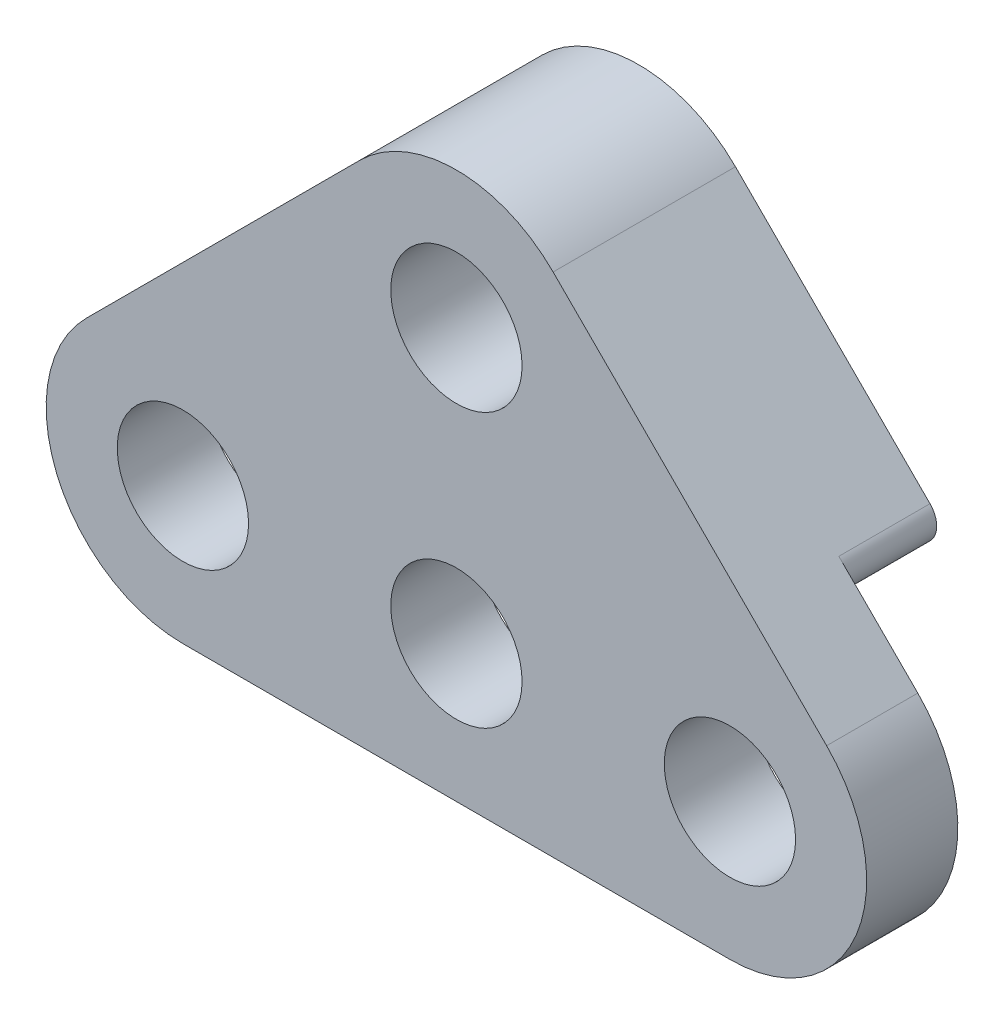
ISO-10303-21;
HEADER;
FILE_DESCRIPTION(('STEP AP214'),'2;1');
FILE_NAME('part.step','',(''),(''),'','','');
FILE_SCHEMA(('AUTOMOTIVE_DESIGN { 1 0 10303 214 1 1 1 1 }'));
ENDSEC;
DATA;
#1=APPLICATION_CONTEXT('core data for automotive mechanical design processes');
#2=APPLICATION_PROTOCOL_DEFINITION('international standard','automotive_design',2000,#1);
#3=PRODUCT_CONTEXT('',#1,'mechanical');
#4=PRODUCT('Part','Part','',(#3));
#5=PRODUCT_RELATED_PRODUCT_CATEGORY('part','',(#4));
#6=PRODUCT_DEFINITION_FORMATION('','',#4);
#7=PRODUCT_DEFINITION_CONTEXT('part definition',#1,'design');
#8=PRODUCT_DEFINITION('design','',#6,#7);
#9=PRODUCT_DEFINITION_SHAPE('','',#8);
#10=(LENGTH_UNIT() NAMED_UNIT(*) SI_UNIT(.MILLI.,.METRE.));
#11=(NAMED_UNIT(*) PLANE_ANGLE_UNIT() SI_UNIT($,.RADIAN.));
#12=(NAMED_UNIT(*) SI_UNIT($,.STERADIAN.) SOLID_ANGLE_UNIT());
#13=UNCERTAINTY_MEASURE_WITH_UNIT(LENGTH_MEASURE(1.E-05),#10,'distance_accuracy_value','');
#14=(GEOMETRIC_REPRESENTATION_CONTEXT(3) GLOBAL_UNCERTAINTY_ASSIGNED_CONTEXT((#13)) GLOBAL_UNIT_ASSIGNED_CONTEXT((#10,
#11,#12)) REPRESENTATION_CONTEXT('',''));
#15=CARTESIAN_POINT('',(0.,0.,0.));
#16=DIRECTION('',(0.,0.,1.));
#17=DIRECTION('',(1.,0.,0.));
#18=AXIS2_PLACEMENT_3D('',#15,#16,#17);
#19=CARTESIAN_POINT('',(0.,-4.7625,3.175));
#20=DIRECTION('',(0.,1.,0.));
#21=DIRECTION('',(-1.,0.,0.));
#22=AXIS2_PLACEMENT_3D('',#19,#20,#21);
#23=PLANE('',#22);
#24=DIRECTION('',(1.,0.,0.));
#25=VECTOR('',#24,1.);
#26=CARTESIAN_POINT('',(0.,-4.7625,0.));
#27=LINE('',#26,#25);
#28=CARTESIAN_POINT('',(-9.525,-4.7625,0.));
#29=VERTEX_POINT('',#28);
#30=CARTESIAN_POINT('',(9.525,-4.7625,0.));
#31=VERTEX_POINT('',#30);
#32=EDGE_CURVE('E186',#29,#31,#27,.T.);
#33=ORIENTED_EDGE('',*,*,#32,.T.);
#34=DIRECTION('',(0.,0.,-1.));
#35=VECTOR('',#34,1.);
#36=CARTESIAN_POINT('',(9.525,-4.7625,3.175));
#37=LINE('',#36,#35);
#38=CARTESIAN_POINT('',(9.525,-4.7625,3.175));
#39=VERTEX_POINT('',#38);
#40=EDGE_CURVE('E201',#39,#31,#37,.T.);
#41=ORIENTED_EDGE('',*,*,#40,.F.);
#42=DIRECTION('',(1.,0.,0.));
#43=VECTOR('',#42,1.);
#44=CARTESIAN_POINT('',(0.,-4.7625,3.175));
#45=LINE('',#44,#43);
#46=CARTESIAN_POINT('',(-9.525,-4.7625,3.175));
#47=VERTEX_POINT('',#46);
#48=EDGE_CURVE('E161',#47,#39,#45,.T.);
#49=ORIENTED_EDGE('',*,*,#48,.F.);
#50=DIRECTION('',(0.,0.,-1.));
#51=VECTOR('',#50,1.);
#52=CARTESIAN_POINT('',(-9.525,-4.7625,3.175));
#53=LINE('',#52,#51);
#54=EDGE_CURVE('E177',#47,#29,#53,.T.);
#55=ORIENTED_EDGE('',*,*,#54,.T.);
#56=EDGE_LOOP('',(#33,#41,#49,#55));
#57=FACE_BOUND('',#56,.T.);
#58=ADVANCED_FACE('F41',(#57),#23,.F.);
#59=CARTESIAN_POINT('',(9.525,0.,3.175));
#60=DIRECTION('',(0.,0.,-1.));
#61=DIRECTION('',(-1.,0.,0.));
#62=AXIS2_PLACEMENT_3D('',#59,#60,#61);
#63=CYLINDRICAL_SURFACE('',#62,4.7625);
#64=CARTESIAN_POINT('',(9.525,0.,0.));
#65=DIRECTION('',(0.,0.,1.));
#66=DIRECTION('',(1.,0.,0.));
#67=AXIS2_PLACEMENT_3D('',#64,#65,#66);
#68=CIRCLE('',#67,4.7625);
#69=CARTESIAN_POINT('',(12.8925960454009,3.36759604540094,0.));
#70=VERTEX_POINT('',#69);
#71=EDGE_CURVE('E189',#31,#70,#68,.T.);
#72=ORIENTED_EDGE('',*,*,#71,.T.);
#73=DIRECTION('',(0.,0.,-1.));
#74=VECTOR('',#73,1.);
#75=CARTESIAN_POINT('',(12.8925960454009,3.36759604540094,3.175));
#76=LINE('',#75,#74);
#77=CARTESIAN_POINT('',(12.8925960454009,3.36759604540094,3.175));
#78=VERTEX_POINT('',#77);
#79=EDGE_CURVE('E132',#78,#70,#76,.T.);
#80=ORIENTED_EDGE('',*,*,#79,.F.);
#81=CARTESIAN_POINT('',(9.525,0.,3.175));
#82=DIRECTION('',(0.,0.,1.));
#83=DIRECTION('',(1.,0.,0.));
#84=AXIS2_PLACEMENT_3D('',#81,#82,#83);
#85=CIRCLE('',#84,4.7625);
#86=EDGE_CURVE('E164',#39,#78,#85,.T.);
#87=ORIENTED_EDGE('',*,*,#86,.F.);
#88=ORIENTED_EDGE('',*,*,#40,.T.);
#89=EDGE_LOOP('',(#72,#80,#87,#88));
#90=FACE_BOUND('',#89,.T.);
#91=ADVANCED_FACE('F247',(#90),#63,.T.);
#92=CARTESIAN_POINT('',(8.13009604540093,8.13009604540093,3.175));
#93=DIRECTION('',(-0.707106781186547,-0.707106781186548,0.));
#94=DIRECTION('',(0.707106781186548,-0.707106781186547,0.));
#95=AXIS2_PLACEMENT_3D('',#92,#93,#94);
#96=PLANE('',#95);
#97=DIRECTION('',(-0.707106781186548,0.707106781186547,0.));
#98=VECTOR('',#97,1.);
#99=CARTESIAN_POINT('',(8.13009604540093,8.13009604540093,0.));
#100=LINE('',#99,#98);
#101=CARTESIAN_POINT('',(10.142676083235,6.11751600756682,0.));
#102=VERTEX_POINT('',#101);
#103=EDGE_CURVE('E56',#70,#102,#100,.T.);
#104=ORIENTED_EDGE('',*,*,#103,.T.);
#105=DIRECTION('',(0.,0.,1.));
#106=VECTOR('',#105,1.);
#107=CARTESIAN_POINT('',(10.142676083235,6.11751600756682,-3.175));
#108=LINE('',#107,#106);
#109=CARTESIAN_POINT('',(10.142676083235,6.11751600756682,-3.175));
#110=VERTEX_POINT('',#109);
#111=EDGE_CURVE('E60',#102,#110,#108,.F.);
#112=ORIENTED_EDGE('',*,*,#111,.T.);
#113=DIRECTION('',(-0.707106781186548,0.707106781186547,0.));
#114=VECTOR('',#113,1.);
#115=CARTESIAN_POINT('',(8.13009604540093,8.13009604540093,-3.175));
#116=LINE('',#115,#114);
#117=CARTESIAN_POINT('',(3.36759604540093,12.8925960454009,-3.175));
#118=VERTEX_POINT('',#117);
#119=EDGE_CURVE('E115',#110,#118,#116,.T.);
#120=ORIENTED_EDGE('',*,*,#119,.T.);
#121=DIRECTION('',(0.,0.,-1.));
#122=VECTOR('',#121,1.);
#123=CARTESIAN_POINT('',(3.36759604540093,12.8925960454009,3.175));
#124=LINE('',#123,#122);
#125=CARTESIAN_POINT('',(3.36759604540093,12.8925960454009,3.175));
#126=VERTEX_POINT('',#125);
#127=EDGE_CURVE('E119',#126,#118,#124,.T.);
#128=ORIENTED_EDGE('',*,*,#127,.F.);
#129=DIRECTION('',(-0.707106781186548,0.707106781186547,0.));
#130=VECTOR('',#129,1.);
#131=CARTESIAN_POINT('',(8.13009604540093,8.13009604540093,3.175));
#132=LINE('',#131,#130);
#133=EDGE_CURVE('E166',#78,#126,#132,.T.);
#134=ORIENTED_EDGE('',*,*,#133,.F.);
#135=ORIENTED_EDGE('',*,*,#79,.T.);
#136=EDGE_LOOP('',(#104,#112,#120,#128,#134,#135));
#137=FACE_BOUND('',#136,.T.);
#138=ADVANCED_FACE('F117',(#137),#96,.F.);
#139=CARTESIAN_POINT('',(0.,9.525,3.175));
#140=DIRECTION('',(0.,0.,-1.));
#141=DIRECTION('',(-1.,0.,0.));
#142=AXIS2_PLACEMENT_3D('',#139,#140,#141);
#143=CYLINDRICAL_SURFACE('',#142,4.7625);
#144=ORIENTED_EDGE('',*,*,#127,.T.);
#145=CARTESIAN_POINT('',(0.,9.525,-3.175));
#146=DIRECTION('',(0.,0.,1.));
#147=DIRECTION('',(1.,0.,0.));
#148=AXIS2_PLACEMENT_3D('',#145,#146,#147);
#149=CIRCLE('',#148,4.7625);
#150=CARTESIAN_POINT('',(-3.36759604540093,12.8925960454009,-3.175));
#151=VERTEX_POINT('',#150);
#152=EDGE_CURVE('E124',#118,#151,#149,.T.);
#153=ORIENTED_EDGE('',*,*,#152,.T.);
#154=DIRECTION('',(0.,0.,-1.));
#155=VECTOR('',#154,1.);
#156=CARTESIAN_POINT('',(-3.36759604540093,12.8925960454009,3.175));
#157=LINE('',#156,#155);
#158=CARTESIAN_POINT('',(-3.36759604540093,12.8925960454009,3.175));
#159=VERTEX_POINT('',#158);
#160=EDGE_CURVE('E133',#159,#151,#157,.T.);
#161=ORIENTED_EDGE('',*,*,#160,.F.);
#162=CARTESIAN_POINT('',(0.,9.525,3.175));
#163=DIRECTION('',(0.,0.,1.));
#164=DIRECTION('',(1.,0.,0.));
#165=AXIS2_PLACEMENT_3D('',#162,#163,#164);
#166=CIRCLE('',#165,4.7625);
#167=EDGE_CURVE('E131',#126,#159,#166,.T.);
#168=ORIENTED_EDGE('',*,*,#167,.F.);
#169=EDGE_LOOP('',(#144,#153,#161,#168));
#170=FACE_BOUND('',#169,.T.);
#171=ADVANCED_FACE('F129',(#170),#143,.T.);
#172=CARTESIAN_POINT('',(-8.13009604540093,8.13009604540093,3.175));
#173=DIRECTION('',(-0.707106781186547,0.707106781186548,0.));
#174=DIRECTION('',(-0.707106781186548,-0.707106781186547,0.));
#175=AXIS2_PLACEMENT_3D('',#172,#173,#174);
#176=PLANE('',#175);
#177=DIRECTION('',(0.707106781186548,0.707106781186547,0.));
#178=VECTOR('',#177,1.);
#179=CARTESIAN_POINT('',(-8.13009604540093,8.13009604540093,-3.175));
#180=LINE('',#179,#178);
#181=CARTESIAN_POINT('',(-10.142676083235,6.11751600756683,-3.175));
#182=VERTEX_POINT('',#181);
#183=EDGE_CURVE('E138',#182,#151,#180,.T.);
#184=ORIENTED_EDGE('',*,*,#183,.F.);
#185=DIRECTION('',(0.,0.,1.));
#186=VECTOR('',#185,1.);
#187=CARTESIAN_POINT('',(-10.142676083235,6.11751600756683,3.175));
#188=LINE('',#187,#186);
#189=CARTESIAN_POINT('',(-10.142676083235,6.11751600756683,0.));
#190=VERTEX_POINT('',#189);
#191=EDGE_CURVE('E204',#182,#190,#188,.T.);
#192=ORIENTED_EDGE('',*,*,#191,.T.);
#193=DIRECTION('',(0.707106781186548,0.707106781186547,0.));
#194=VECTOR('',#193,1.);
#195=CARTESIAN_POINT('',(-8.13009604540093,8.13009604540093,0.));
#196=LINE('',#195,#194);
#197=CARTESIAN_POINT('',(-12.8925960454009,3.36759604540093,0.));
#198=VERTEX_POINT('',#197);
#199=EDGE_CURVE('E192',#198,#190,#196,.T.);
#200=ORIENTED_EDGE('',*,*,#199,.F.);
#201=DIRECTION('',(0.,0.,-1.));
#202=VECTOR('',#201,1.);
#203=CARTESIAN_POINT('',(-12.8925960454009,3.36759604540093,3.175));
#204=LINE('',#203,#202);
#205=CARTESIAN_POINT('',(-12.8925960454009,3.36759604540093,3.175));
#206=VERTEX_POINT('',#205);
#207=EDGE_CURVE('E197',#206,#198,#204,.T.);
#208=ORIENTED_EDGE('',*,*,#207,.F.);
#209=DIRECTION('',(0.707106781186548,0.707106781186547,0.));
#210=VECTOR('',#209,1.);
#211=CARTESIAN_POINT('',(-8.13009604540093,8.13009604540093,3.175));
#212=LINE('',#211,#210);
#213=EDGE_CURVE('E169',#206,#159,#212,.T.);
#214=ORIENTED_EDGE('',*,*,#213,.T.);
#215=ORIENTED_EDGE('',*,*,#160,.T.);
#216=EDGE_LOOP('',(#184,#192,#200,#208,#214,#215));
#217=FACE_BOUND('',#216,.T.);
#218=ADVANCED_FACE('F231',(#217),#176,.T.);
#219=CARTESIAN_POINT('',(-9.525,0.,3.175));
#220=DIRECTION('',(0.,0.,-1.));
#221=DIRECTION('',(-1.,0.,0.));
#222=AXIS2_PLACEMENT_3D('',#219,#220,#221);
#223=CYLINDRICAL_SURFACE('',#222,4.7625);
#224=CARTESIAN_POINT('',(-9.525,0.,0.));
#225=DIRECTION('',(0.,0.,1.));
#226=DIRECTION('',(1.,0.,0.));
#227=AXIS2_PLACEMENT_3D('',#224,#225,#226);
#228=CIRCLE('',#227,4.7625);
#229=EDGE_CURVE('E155',#198,#29,#228,.T.);
#230=ORIENTED_EDGE('',*,*,#229,.T.);
#231=ORIENTED_EDGE('',*,*,#54,.F.);
#232=CARTESIAN_POINT('',(-9.525,0.,3.175));
#233=DIRECTION('',(0.,0.,1.));
#234=DIRECTION('',(1.,0.,0.));
#235=AXIS2_PLACEMENT_3D('',#232,#233,#234);
#236=CIRCLE('',#235,4.7625);
#237=EDGE_CURVE('E172',#206,#47,#236,.T.);
#238=ORIENTED_EDGE('',*,*,#237,.F.);
#239=ORIENTED_EDGE('',*,*,#207,.T.);
#240=EDGE_LOOP('',(#230,#231,#238,#239));
#241=FACE_BOUND('',#240,.T.);
#242=ADVANCED_FACE('F260',(#241),#223,.T.);
#243=CARTESIAN_POINT('',(-9.525,0.,3.175));
#244=DIRECTION('',(0.,0.,-1.));
#245=DIRECTION('',(-1.,0.,0.));
#246=AXIS2_PLACEMENT_3D('',#243,#244,#245);
#247=CYLINDRICAL_SURFACE('',#246,2.286);
#248=CARTESIAN_POINT('',(-9.525,0.,3.175));
#249=DIRECTION('',(0.,0.,1.));
#250=DIRECTION('',(1.,0.,0.));
#251=AXIS2_PLACEMENT_3D('',#248,#249,#250);
#252=CIRCLE('',#251,2.286);
#253=CARTESIAN_POINT('',(-7.239,0.,3.175));
#254=VERTEX_POINT('',#253);
#255=EDGE_CURVE('E158',#254,#254,#252,.T.);
#256=ORIENTED_EDGE('',*,*,#255,.T.);
#257=EDGE_LOOP('',(#256));
#258=FACE_BOUND('',#257,.T.);
#259=CARTESIAN_POINT('',(-9.525,0.,0.));
#260=DIRECTION('',(0.,0.,1.));
#261=DIRECTION('',(1.,0.,0.));
#262=AXIS2_PLACEMENT_3D('',#259,#260,#261);
#263=CIRCLE('',#262,2.286);
#264=CARTESIAN_POINT('',(-7.239,0.,0.));
#265=VERTEX_POINT('',#264);
#266=EDGE_CURVE('E183',#265,#265,#263,.T.);
#267=ORIENTED_EDGE('',*,*,#266,.F.);
#268=EDGE_LOOP('',(#267));
#269=FACE_BOUND('',#268,.T.);
#270=ADVANCED_FACE('F256',(#258,#269),#247,.F.);
#271=CARTESIAN_POINT('',(9.525,0.,3.175));
#272=DIRECTION('',(0.,0.,-1.));
#273=DIRECTION('',(-1.,0.,0.));
#274=AXIS2_PLACEMENT_3D('',#271,#272,#273);
#275=CYLINDRICAL_SURFACE('',#274,2.286);
#276=CARTESIAN_POINT('',(9.525,0.,3.175));
#277=DIRECTION('',(0.,0.,1.));
#278=DIRECTION('',(1.,0.,0.));
#279=AXIS2_PLACEMENT_3D('',#276,#277,#278);
#280=CIRCLE('',#279,2.286);
#281=CARTESIAN_POINT('',(11.811,0.,3.175));
#282=VERTEX_POINT('',#281);
#283=EDGE_CURVE('E154',#282,#282,#280,.T.);
#284=ORIENTED_EDGE('',*,*,#283,.T.);
#285=EDGE_LOOP('',(#284));
#286=FACE_BOUND('',#285,.T.);
#287=CARTESIAN_POINT('',(9.525,0.,0.));
#288=DIRECTION('',(0.,0.,1.));
#289=DIRECTION('',(1.,0.,0.));
#290=AXIS2_PLACEMENT_3D('',#287,#288,#289);
#291=CIRCLE('',#290,2.286);
#292=CARTESIAN_POINT('',(11.811,0.,0.));
#293=VERTEX_POINT('',#292);
#294=EDGE_CURVE('E180',#293,#293,#291,.T.);
#295=ORIENTED_EDGE('',*,*,#294,.F.);
#296=EDGE_LOOP('',(#295));
#297=FACE_BOUND('',#296,.T.);
#298=ADVANCED_FACE('F259',(#286,#297),#275,.F.);
#299=CARTESIAN_POINT('',(0.,0.,3.175));
#300=DIRECTION('',(0.,0.,-1.));
#301=DIRECTION('',(-1.,0.,0.));
#302=AXIS2_PLACEMENT_3D('',#299,#300,#301);
#303=CYLINDRICAL_SURFACE('',#302,2.286);
#304=CARTESIAN_POINT('',(0.,0.,3.175));
#305=DIRECTION('',(0.,0.,1.));
#306=DIRECTION('',(1.,0.,0.));
#307=AXIS2_PLACEMENT_3D('',#304,#305,#306);
#308=CIRCLE('',#307,2.286);
#309=CARTESIAN_POINT('',(2.286,0.,3.175));
#310=VERTEX_POINT('',#309);
#311=EDGE_CURVE('E151',#310,#310,#308,.T.);
#312=ORIENTED_EDGE('',*,*,#311,.T.);
#313=EDGE_LOOP('',(#312));
#314=FACE_BOUND('',#313,.T.);
#315=CARTESIAN_POINT('',(0.,0.,0.));
#316=DIRECTION('',(0.,0.,1.));
#317=DIRECTION('',(1.,0.,0.));
#318=AXIS2_PLACEMENT_3D('',#315,#316,#317);
#319=CIRCLE('',#318,2.286);
#320=CARTESIAN_POINT('',(2.286,0.,0.));
#321=VERTEX_POINT('',#320);
#322=EDGE_CURVE('E147',#321,#321,#319,.T.);
#323=ORIENTED_EDGE('',*,*,#322,.F.);
#324=EDGE_LOOP('',(#323));
#325=FACE_BOUND('',#324,.T.);
#326=ADVANCED_FACE('F264',(#314,#325),#303,.F.);
#327=CARTESIAN_POINT('',(0.,9.525,3.175));
#328=DIRECTION('',(0.,0.,-1.));
#329=DIRECTION('',(-1.,0.,0.));
#330=AXIS2_PLACEMENT_3D('',#327,#328,#329);
#331=CYLINDRICAL_SURFACE('',#330,2.286);
#332=CARTESIAN_POINT('',(0.,9.525,3.175));
#333=DIRECTION('',(0.,0.,1.));
#334=DIRECTION('',(1.,0.,0.));
#335=AXIS2_PLACEMENT_3D('',#332,#333,#334);
#336=CIRCLE('',#335,2.286);
#337=CARTESIAN_POINT('',(2.286,9.525,3.175));
#338=VERTEX_POINT('',#337);
#339=EDGE_CURVE('E174',#338,#338,#336,.T.);
#340=ORIENTED_EDGE('',*,*,#339,.T.);
#341=EDGE_LOOP('',(#340));
#342=FACE_BOUND('',#341,.T.);
#343=CARTESIAN_POINT('',(0.,9.525,-3.175));
#344=DIRECTION('',(0.,0.,1.));
#345=DIRECTION('',(1.,0.,0.));
#346=AXIS2_PLACEMENT_3D('',#343,#344,#345);
#347=CIRCLE('',#346,2.286);
#348=CARTESIAN_POINT('',(2.286,9.525,-3.175));
#349=VERTEX_POINT('',#348);
#350=EDGE_CURVE('E125',#349,#349,#347,.T.);
#351=ORIENTED_EDGE('',*,*,#350,.F.);
#352=EDGE_LOOP('',(#351));
#353=FACE_BOUND('',#352,.T.);
#354=ADVANCED_FACE('F267',(#342,#353),#331,.F.);
#355=CARTESIAN_POINT('',(0.,0.,3.175));
#356=DIRECTION('',(0.,0.,1.));
#357=DIRECTION('',(1.,0.,0.));
#358=AXIS2_PLACEMENT_3D('',#355,#356,#357);
#359=PLANE('',#358);
#360=ORIENTED_EDGE('',*,*,#311,.F.);
#361=EDGE_LOOP('',(#360));
#362=FACE_BOUND('',#361,.T.);
#363=ORIENTED_EDGE('',*,*,#283,.F.);
#364=EDGE_LOOP('',(#363));
#365=FACE_BOUND('',#364,.T.);
#366=ORIENTED_EDGE('',*,*,#255,.F.);
#367=EDGE_LOOP('',(#366));
#368=FACE_BOUND('',#367,.T.);
#369=ORIENTED_EDGE('',*,*,#48,.T.);
#370=ORIENTED_EDGE('',*,*,#86,.T.);
#371=ORIENTED_EDGE('',*,*,#133,.T.);
#372=ORIENTED_EDGE('',*,*,#167,.T.);
#373=ORIENTED_EDGE('',*,*,#213,.F.);
#374=ORIENTED_EDGE('',*,*,#237,.T.);
#375=EDGE_LOOP('',(#369,#370,#371,#372,#373,#374));
#376=FACE_BOUND('',#375,.T.);
#377=ORIENTED_EDGE('',*,*,#339,.F.);
#378=EDGE_LOOP('',(#377));
#379=FACE_BOUND('',#378,.T.);
#380=ADVANCED_FACE('F235',(#362,#365,#368,#376,#379),#359,.T.);
#381=CARTESIAN_POINT('',(0.,0.,0.));
#382=DIRECTION('',(0.,0.,1.));
#383=DIRECTION('',(1.,0.,0.));
#384=AXIS2_PLACEMENT_3D('',#381,#382,#383);
#385=PLANE('',#384);
#386=ORIENTED_EDGE('',*,*,#322,.T.);
#387=EDGE_LOOP('',(#386));
#388=FACE_BOUND('',#387,.T.);
#389=ORIENTED_EDGE('',*,*,#294,.T.);
#390=EDGE_LOOP('',(#389));
#391=FACE_BOUND('',#390,.T.);
#392=ORIENTED_EDGE('',*,*,#266,.T.);
#393=EDGE_LOOP('',(#392));
#394=FACE_BOUND('',#393,.T.);
#395=ORIENTED_EDGE('',*,*,#199,.T.);
#396=CARTESIAN_POINT('',(-9.58141007566821,5.55625,0.));
#397=DIRECTION('',(0.,0.,1.));
#398=DIRECTION('',(1.,0.,0.));
#399=AXIS2_PLACEMENT_3D('',#396,#397,#398);
#400=CIRCLE('',#399,0.79375);
#401=CARTESIAN_POINT('',(-9.58141007566821,4.7625,0.));
#402=VERTEX_POINT('',#401);
#403=EDGE_CURVE('E49',#190,#402,#400,.T.);
#404=ORIENTED_EDGE('',*,*,#403,.T.);
#405=DIRECTION('',(1.,0.,0.));
#406=VECTOR('',#405,1.);
#407=CARTESIAN_POINT('',(0.,4.7625,0.));
#408=LINE('',#407,#406);
#409=CARTESIAN_POINT('',(9.58141007566822,4.7625,0.));
#410=VERTEX_POINT('',#409);
#411=EDGE_CURVE('E148',#402,#410,#408,.T.);
#412=ORIENTED_EDGE('',*,*,#411,.T.);
#413=CARTESIAN_POINT('',(9.58141007566822,5.55625,0.));
#414=DIRECTION('',(0.,0.,1.));
#415=DIRECTION('',(1.,0.,0.));
#416=AXIS2_PLACEMENT_3D('',#413,#414,#415);
#417=CIRCLE('',#416,0.79375);
#418=EDGE_CURVE('E11',#410,#102,#417,.T.);
#419=ORIENTED_EDGE('',*,*,#418,.T.);
#420=ORIENTED_EDGE('',*,*,#103,.F.);
#421=ORIENTED_EDGE('',*,*,#71,.F.);
#422=ORIENTED_EDGE('',*,*,#32,.F.);
#423=ORIENTED_EDGE('',*,*,#229,.F.);
#424=EDGE_LOOP('',(#395,#404,#412,#419,#420,#421,#422,#423));
#425=FACE_BOUND('',#424,.T.);
#426=ADVANCED_FACE('F219',(#388,#391,#394,#425),#385,.F.);
#427=CARTESIAN_POINT('',(0.,4.7625,-3.175));
#428=DIRECTION('',(0.,-1.,0.));
#429=DIRECTION('',(1.,0.,0.));
#430=AXIS2_PLACEMENT_3D('',#427,#428,#429);
#431=PLANE('',#430);
#432=ORIENTED_EDGE('',*,*,#411,.F.);
#433=DIRECTION('',(0.,0.,1.));
#434=VECTOR('',#433,1.);
#435=CARTESIAN_POINT('',(-9.58141007566821,4.7625,-3.175));
#436=LINE('',#435,#434);
#437=CARTESIAN_POINT('',(-9.58141007566821,4.7625,-3.175));
#438=VERTEX_POINT('',#437);
#439=EDGE_CURVE('E210',#402,#438,#436,.F.);
#440=ORIENTED_EDGE('',*,*,#439,.T.);
#441=DIRECTION('',(1.,0.,0.));
#442=VECTOR('',#441,1.);
#443=CARTESIAN_POINT('',(0.,4.7625,-3.175));
#444=LINE('',#443,#442);
#445=CARTESIAN_POINT('',(9.58141007566822,4.7625,-3.175));
#446=VERTEX_POINT('',#445);
#447=EDGE_CURVE('E141',#438,#446,#444,.T.);
#448=ORIENTED_EDGE('',*,*,#447,.T.);
#449=DIRECTION('',(0.,0.,1.));
#450=VECTOR('',#449,1.);
#451=CARTESIAN_POINT('',(9.58141007566822,4.7625,0.));
#452=LINE('',#451,#450);
#453=EDGE_CURVE('E207',#446,#410,#452,.T.);
#454=ORIENTED_EDGE('',*,*,#453,.T.);
#455=EDGE_LOOP('',(#432,#440,#448,#454));
#456=FACE_BOUND('',#455,.T.);
#457=ADVANCED_FACE('F226',(#456),#431,.T.);
#458=CARTESIAN_POINT('',(0.,0.,-3.175));
#459=DIRECTION('',(0.,0.,1.));
#460=DIRECTION('',(1.,0.,0.));
#461=AXIS2_PLACEMENT_3D('',#458,#459,#460);
#462=PLANE('',#461);
#463=ORIENTED_EDGE('',*,*,#350,.T.);
#464=EDGE_LOOP('',(#463));
#465=FACE_BOUND('',#464,.T.);
#466=ORIENTED_EDGE('',*,*,#447,.F.);
#467=CARTESIAN_POINT('',(-9.58141007566821,5.55625,-3.175));
#468=DIRECTION('',(0.,0.,1.));
#469=DIRECTION('',(1.,0.,0.));
#470=AXIS2_PLACEMENT_3D('',#467,#468,#469);
#471=CIRCLE('',#470,0.79375);
#472=EDGE_CURVE('E214',#438,#182,#471,.F.);
#473=ORIENTED_EDGE('',*,*,#472,.T.);
#474=ORIENTED_EDGE('',*,*,#183,.T.);
#475=ORIENTED_EDGE('',*,*,#152,.F.);
#476=ORIENTED_EDGE('',*,*,#119,.F.);
#477=CARTESIAN_POINT('',(9.58141007566822,5.55625,-3.175));
#478=DIRECTION('',(0.,0.,1.));
#479=DIRECTION('',(1.,0.,0.));
#480=AXIS2_PLACEMENT_3D('',#477,#478,#479);
#481=CIRCLE('',#480,0.79375);
#482=EDGE_CURVE('E212',#110,#446,#481,.F.);
#483=ORIENTED_EDGE('',*,*,#482,.T.);
#484=EDGE_LOOP('',(#466,#473,#474,#475,#476,#483));
#485=FACE_BOUND('',#484,.T.);
#486=ADVANCED_FACE('F136',(#465,#485),#462,.F.);
#487=CARTESIAN_POINT('',(-9.58141007566821,5.55625,3.175));
#488=DIRECTION('',(0.,0.,1.));
#489=DIRECTION('',(1.,0.,0.));
#490=AXIS2_PLACEMENT_3D('',#487,#488,#489);
#491=CYLINDRICAL_SURFACE('',#490,0.79375);
#492=ORIENTED_EDGE('',*,*,#472,.F.);
#493=ORIENTED_EDGE('',*,*,#439,.F.);
#494=ORIENTED_EDGE('',*,*,#403,.F.);
#495=ORIENTED_EDGE('',*,*,#191,.F.);
#496=EDGE_LOOP('',(#492,#493,#494,#495));
#497=FACE_BOUND('',#496,.T.);
#498=ADVANCED_FACE('F229',(#497),#491,.T.);
#499=CARTESIAN_POINT('',(9.58141007566822,5.55625,-3.175));
#500=DIRECTION('',(0.,0.,-1.));
#501=DIRECTION('',(-1.,0.,0.));
#502=AXIS2_PLACEMENT_3D('',#499,#500,#501);
#503=CYLINDRICAL_SURFACE('',#502,0.79375);
#504=ORIENTED_EDGE('',*,*,#482,.F.);
#505=ORIENTED_EDGE('',*,*,#111,.F.);
#506=ORIENTED_EDGE('',*,*,#418,.F.);
#507=ORIENTED_EDGE('',*,*,#453,.F.);
#508=EDGE_LOOP('',(#504,#505,#506,#507));
#509=FACE_BOUND('',#508,.T.);
#510=ADVANCED_FACE('F43',(#509),#503,.T.);
#511=CLOSED_SHELL('',(#58,#91,#138,#171,#218,#242,#270,#298,#326,#354,#380,#426,#457,#486,#498,#510));
#512=MANIFOLD_SOLID_BREP('B2',#511);
#513=ADVANCED_BREP_SHAPE_REPRESENTATION('',(#18,#512),#14);
#514=SHAPE_DEFINITION_REPRESENTATION(#9,#513);
ENDSEC;
END-ISO-10303-21;
